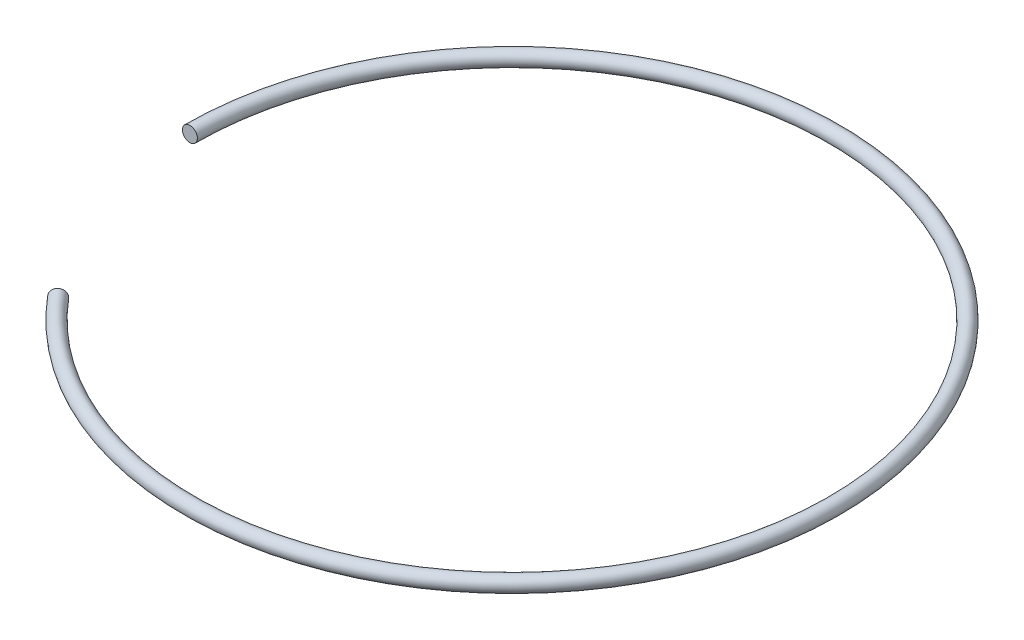
ISO-10303-21;
HEADER;
FILE_DESCRIPTION(('STEP AP214'),'2;1');
FILE_NAME('part.step','',(''),(''),'','','');
FILE_SCHEMA(('AUTOMOTIVE_DESIGN { 1 0 10303 214 1 1 1 1 }'));
ENDSEC;
DATA;
#1=APPLICATION_CONTEXT('core data for automotive mechanical design processes');
#2=APPLICATION_PROTOCOL_DEFINITION('international standard','automotive_design',2000,#1);
#3=PRODUCT_CONTEXT('',#1,'mechanical');
#4=PRODUCT('Part','Part','',(#3));
#5=PRODUCT_RELATED_PRODUCT_CATEGORY('part','',(#4));
#6=PRODUCT_DEFINITION_FORMATION('','',#4);
#7=PRODUCT_DEFINITION_CONTEXT('part definition',#1,'design');
#8=PRODUCT_DEFINITION('design','',#6,#7);
#9=PRODUCT_DEFINITION_SHAPE('','',#8);
#10=(LENGTH_UNIT() NAMED_UNIT(*) SI_UNIT(.MILLI.,.METRE.));
#11=(NAMED_UNIT(*) PLANE_ANGLE_UNIT() SI_UNIT($,.RADIAN.));
#12=(NAMED_UNIT(*) SI_UNIT($,.STERADIAN.) SOLID_ANGLE_UNIT());
#13=UNCERTAINTY_MEASURE_WITH_UNIT(LENGTH_MEASURE(1.E-05),#10,'distance_accuracy_value','');
#14=(GEOMETRIC_REPRESENTATION_CONTEXT(3) GLOBAL_UNCERTAINTY_ASSIGNED_CONTEXT((#13)) GLOBAL_UNIT_ASSIGNED_CONTEXT((#10,
#11,#12)) REPRESENTATION_CONTEXT('',''));
#15=CARTESIAN_POINT('',(0.,0.,0.));
#16=DIRECTION('',(0.,0.,1.));
#17=DIRECTION('',(1.,0.,0.));
#18=AXIS2_PLACEMENT_3D('',#15,#16,#17);
#19=CARTESIAN_POINT('',(0.,4.,0.));
#20=DIRECTION('',(0.,0.,1.));
#21=DIRECTION('',(1.,0.,0.));
#22=AXIS2_PLACEMENT_3D('',#19,#20,#21);
#23=PLANE('',#22);
#24=CARTESIAN_POINT('',(-6.3,0.440000000000002,0.));
#25=CARTESIAN_POINT('',(-6.30001062983499,0.42319249164499,0.));
#26=CARTESIAN_POINT('',(-6.30287538462174,0.406281558710686,0.));
#27=CARTESIAN_POINT('',(-6.31403597751348,0.374416764003044,0.));
#28=CARTESIAN_POINT('',(-6.32233181561848,0.359462902229706,0.));
#29=CARTESIAN_POINT('',(-6.34340700512756,0.333129254032242,0.));
#30=CARTESIAN_POINT('',(-6.35618635653177,0.321749467608205,0.));
#31=CARTESIAN_POINT('',(-6.38479109373738,0.303865334950795,0.));
#32=CARTESIAN_POINT('',(-6.40061647953878,0.297360988717422,0.));
#33=CARTESIAN_POINT('',(-6.43352818642906,0.289956461444852,0.));
#34=CARTESIAN_POINT('',(-6.45061450751794,0.289056280405655,0.));
#35=CARTESIAN_POINT('',(-6.48412206349802,0.292961554634674,0.));
#36=CARTESIAN_POINT('',(-6.50054329838922,0.29776700990289,0.));
#37=CARTESIAN_POINT('',(-6.53086889279606,0.312546438693667,0.));
#38=CARTESIAN_POINT('',(-6.54477325231169,0.32252041221623,0.));
#39=CARTESIAN_POINT('',(-6.56849883134805,0.346493762829984,0.));
#40=CARTESIAN_POINT('',(-6.57832005086878,0.360493139921176,0.));
#41=CARTESIAN_POINT('',(-6.59276711566352,0.391008812850515,0.));
#42=CARTESIAN_POINT('',(-6.59739296093752,0.407525108688661,0.));
#43=CARTESIAN_POINT('',(-6.59972637429642,0.429476017085077,0.));
#44=CARTESIAN_POINT('',(-6.60000333113523,0.4347329301619,0.));
#45=CARTESIAN_POINT('',(-6.59998937016501,0.456807508355013,0.));
#46=CARTESIAN_POINT('',(-6.59712461537826,0.473718441289317,0.));
#47=CARTESIAN_POINT('',(-6.58596402248651,0.505583235996959,0.));
#48=CARTESIAN_POINT('',(-6.57766818438152,0.520537097770297,0.));
#49=CARTESIAN_POINT('',(-6.55659299487244,0.546870745967762,0.));
#50=CARTESIAN_POINT('',(-6.54381364346823,0.558250532391798,0.));
#51=CARTESIAN_POINT('',(-6.51520890626262,0.576134665049208,0.));
#52=CARTESIAN_POINT('',(-6.49938352046122,0.582639011282581,0.));
#53=CARTESIAN_POINT('',(-6.46647181357094,0.590043538555151,0.));
#54=CARTESIAN_POINT('',(-6.44938549248206,0.590943719594348,0.));
#55=CARTESIAN_POINT('',(-6.41587793650198,0.58703844536533,0.));
#56=CARTESIAN_POINT('',(-6.39945670161078,0.582232990097114,0.));
#57=CARTESIAN_POINT('',(-6.36913110720394,0.567453561306336,0.));
#58=CARTESIAN_POINT('',(-6.35522674768831,0.557479587783774,0.));
#59=CARTESIAN_POINT('',(-6.33150116865195,0.533506237170019,0.));
#60=CARTESIAN_POINT('',(-6.32167994913122,0.519506860078827,0.));
#61=CARTESIAN_POINT('',(-6.30723288433648,0.488991187149489,0.));
#62=CARTESIAN_POINT('',(-6.30260703906248,0.472474891311343,0.));
#63=CARTESIAN_POINT('',(-6.30027362570358,0.450523982914926,0.));
#64=CARTESIAN_POINT('',(-6.29999666886477,0.445267069838104,0.));
#65=CARTESIAN_POINT('',(-6.3,0.440000000000002,0.));
#66=B_SPLINE_CURVE_WITH_KNOTS('',3,(#24,#25,#26,#27,#28,#29,#30,#31,#32,#33,#34,#35,#36,#37,#38,
#39,#40,#41,#42,#43,#44,#45,#46,#47,#48,#49,#50,#51,#52,#53,#54,#55,#56,#57,#58,#59,#60,#61,#62,
#63,#64,#65),.UNSPECIFIED.,.T.,.F.,(4,2,2,2,2,2,2,2,2,2,2,2,2,2,2,2,2,2,2,2,4),(0.,
0.0503657057955508,0.100731411591101,0.151097117387924,0.201462823184746,0.251828528981568,
0.302194234778389,0.352559940575211,0.402925646372033,0.453291352168854,0.469074755887429,
0.51944046168298,0.569806167478531,0.620171873275353,0.670537579072175,0.720903284868997,
0.771268990665819,0.82163469646264,0.872000402259463,0.922366108056284,0.938149511774859),.UNSPECIFIED.);
#67=CARTESIAN_POINT('',(-6.3,0.440000000000002,0.));
#68=VERTEX_POINT('',#67);
#69=EDGE_CURVE('E18',#68,#68,#66,.T.);
#70=ORIENTED_EDGE('',*,*,#69,.F.);
#71=EDGE_LOOP('',(#70));
#72=FACE_BOUND('',#71,.T.);
#73=ADVANCED_FACE('F14',(#72),#23,.T.);
#74=CARTESIAN_POINT('',(0.,4.,0.));
#75=DIRECTION('',(0.64278760968653,0.,0.766044443118986));
#76=DIRECTION('',(0.766044443118986,0.,-0.64278760968653));
#77=AXIS2_PLACEMENT_3D('',#74,#75,#76);
#78=PLANE('',#77);
#79=CARTESIAN_POINT('',(-5.05589332458531,0.440000000000002,4.2423982239311));
#80=CARTESIAN_POINT('',(-5.05588518165928,0.42319249164499,4.24239139120487));
#81=CARTESIAN_POINT('',(-5.05369065217399,0.406281558710686,4.24054996232316));
#82=CARTESIAN_POINT('',(-5.04514114200736,0.374416764003044,4.23337607149559));
#83=CARTESIAN_POINT('',(-5.03878616132601,0.359462902229706,4.22804360954974));
#84=CARTESIAN_POINT('',(-5.0226416295149,0.333129254032242,4.2144967388615));
#85=CARTESIAN_POINT('',(-5.01285207838504,0.321749467608205,4.20628233011905));
#86=CARTESIAN_POINT('',(-4.99093957840181,0.303865334950796,4.18789555946494));
#87=CARTESIAN_POINT('',(-4.97881662954843,0.297360988717422,4.17772319755329));
#88=CARTESIAN_POINT('',(-4.95360479937157,0.289956461444852,4.15656796015058));
#89=CARTESIAN_POINT('',(-4.94051591804809,0.289056280405655,4.14558508465953));
#90=CARTESIAN_POINT('',(-4.91484764098705,0.292961554634674,4.12404684284466));
#91=CARTESIAN_POINT('',(-4.90226824524949,0.297767009902889,4.11349147652084));
#92=CARTESIAN_POINT('',(-4.87903749216985,0.312546438693667,4.09399856017974));
#93=CARTESIAN_POINT('',(-4.86838613482777,0.322520412216229,4.08506101016247));
#94=CARTESIAN_POINT('',(-4.85021128684719,0.346493762829983,4.06981050192526));
#95=CARTESIAN_POINT('',(-4.84268779620868,0.360493139921176,4.06349754370532));
#96=CARTESIAN_POINT('',(-4.83162070250329,0.391008812850514,4.05421114945893));
#97=CARTESIAN_POINT('',(-4.82807709943641,0.40752510868866,4.05123771343247));
#98=CARTESIAN_POINT('',(-4.82628960109933,0.429476017085077,4.04973782423709));
#99=CARTESIAN_POINT('',(-4.82607743985198,0.434732930161899,4.04955979981268));
#100=CARTESIAN_POINT('',(-4.82608813457564,0.456807508355013,4.04956877375136));
#101=CARTESIAN_POINT('',(-4.82828266406093,0.473718441289317,4.05141020263308));
#102=CARTESIAN_POINT('',(-4.83683217422756,0.505583235996959,4.05858409346065));
#103=CARTESIAN_POINT('',(-4.84318715490891,0.520537097770297,4.0639165554065));
#104=CARTESIAN_POINT('',(-4.85933168672002,0.546870745967762,4.07746342609474));
#105=CARTESIAN_POINT('',(-4.86912123784987,0.558250532391798,4.08567783483719));
#106=CARTESIAN_POINT('',(-4.89103373783311,0.576134665049208,4.10406460549129));
#107=CARTESIAN_POINT('',(-4.90315668668649,0.582639011282581,4.11423696740295));
#108=CARTESIAN_POINT('',(-4.92836851686335,0.590043538555151,4.13539220480565));
#109=CARTESIAN_POINT('',(-4.94145739818683,0.590943719594348,4.14637508029671));
#110=CARTESIAN_POINT('',(-4.96712567524787,0.58703844536533,4.16791332211158));
#111=CARTESIAN_POINT('',(-4.97970507098543,0.582232990097114,4.1784686884354));
#112=CARTESIAN_POINT('',(-5.00293582406507,0.567453561306336,4.1979616047765));
#113=CARTESIAN_POINT('',(-5.01358718140714,0.557479587783773,4.20689915479377));
#114=CARTESIAN_POINT('',(-5.03176202938773,0.533506237170019,4.22214966303098));
#115=CARTESIAN_POINT('',(-5.03928552002623,0.519506860078827,4.22846262125092));
#116=CARTESIAN_POINT('',(-5.05035261373162,0.488991187149488,4.23774901549731));
#117=CARTESIAN_POINT('',(-5.0538962167985,0.472474891311343,4.24072245152377));
#118=CARTESIAN_POINT('',(-5.05568371513559,0.450523982914926,4.24222234071915));
#119=CARTESIAN_POINT('',(-5.05589587638294,0.445267069838104,4.24240036514355));
#120=CARTESIAN_POINT('',(-5.05589332458531,0.440000000000002,4.2423982239311));
#121=B_SPLINE_CURVE_WITH_KNOTS('',3,(#79,#80,#81,#82,#83,#84,#85,#86,#87,#88,#89,#90,#91,#92,
#93,#94,#95,#96,#97,#98,#99,#100,#101,#102,#103,#104,#105,#106,#107,#108,#109,#110,#111,#112,
#113,#114,#115,#116,#117,#118,#119,#120),.UNSPECIFIED.,.T.,.F.,(4,2,2,2,2,2,2,2,2,2,2,2,2,2,2,2,
2,2,2,2,4),(0.,0.0503657057955508,0.100731411591101,0.151097117387924,0.201462823184745,
0.251828528981567,0.302194234778388,0.35255994057521,0.402925646372032,0.453291352168854,
0.469074755887429,0.51944046168298,0.569806167478531,0.620171873275353,0.670537579072175,
0.720903284868997,0.771268990665819,0.821634696462641,0.872000402259463,0.922366108056284,
0.938149511774859),.UNSPECIFIED.);
#122=CARTESIAN_POINT('',(-5.05589332458531,0.440000000000002,4.2423982239311));
#123=VERTEX_POINT('',#122);
#124=EDGE_CURVE('E10',#123,#123,#121,.T.);
#125=ORIENTED_EDGE('',*,*,#124,.F.);
#126=EDGE_LOOP('',(#125));
#127=FACE_BOUND('',#126,.T.);
#128=ADVANCED_FACE('F34',(#127),#78,.F.);
#129=CARTESIAN_POINT('',(0.,0.440000000000002,0.));
#130=DIRECTION('',(0.,-1.,0.));
#131=DIRECTION('',(0.,0.,1.));
#132=AXIS2_PLACEMENT_3D('',#129,#130,#131);
#133=TOROIDAL_SURFACE('',#132,6.45,0.150000000000001);
#134=ORIENTED_EDGE('',*,*,#124,.T.);
#135=EDGE_LOOP('',(#134));
#136=FACE_BOUND('',#135,.T.);
#137=ORIENTED_EDGE('',*,*,#69,.T.);
#138=EDGE_LOOP('',(#137));
#139=FACE_BOUND('',#138,.T.);
#140=ADVANCED_FACE('F36',(#136,#139),#133,.T.);
#141=CLOSED_SHELL('',(#73,#128,#140));
#142=MANIFOLD_SOLID_BREP('B1',#141);
#143=ADVANCED_BREP_SHAPE_REPRESENTATION('',(#18,#142),#14);
#144=SHAPE_DEFINITION_REPRESENTATION(#9,#143);
ENDSEC;
END-ISO-10303-21;
